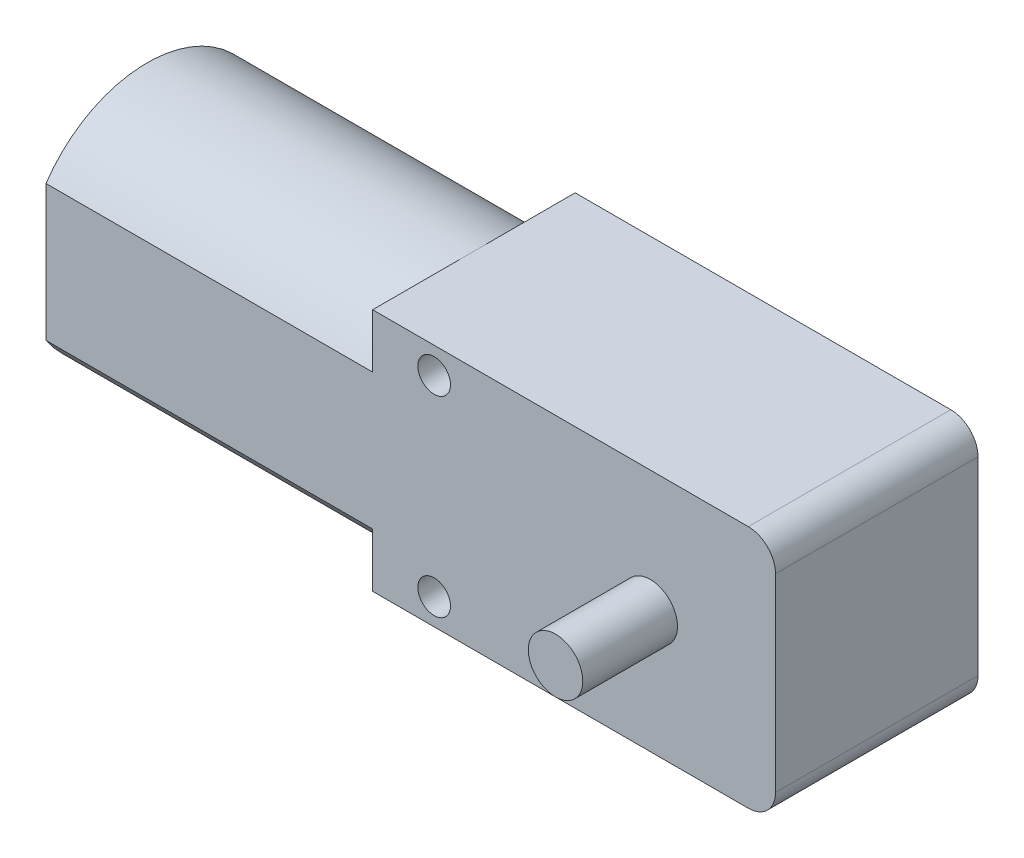
ISO-10303-21;
HEADER;
FILE_DESCRIPTION(('STEP AP214'),'2;1');
FILE_NAME('part.step','',(''),(''),'','','');
FILE_SCHEMA(('AUTOMOTIVE_DESIGN { 1 0 10303 214 1 1 1 1 }'));
ENDSEC;
DATA;
#1=APPLICATION_CONTEXT('core data for automotive mechanical design processes');
#2=APPLICATION_PROTOCOL_DEFINITION('international standard','automotive_design',2000,#1);
#3=PRODUCT_CONTEXT('',#1,'mechanical');
#4=PRODUCT('Part','Part','',(#3));
#5=PRODUCT_RELATED_PRODUCT_CATEGORY('part','',(#4));
#6=PRODUCT_DEFINITION_FORMATION('','',#4);
#7=PRODUCT_DEFINITION_CONTEXT('part definition',#1,'design');
#8=PRODUCT_DEFINITION('design','',#6,#7);
#9=PRODUCT_DEFINITION_SHAPE('','',#8);
#10=(LENGTH_UNIT() NAMED_UNIT(*) SI_UNIT(.MILLI.,.METRE.));
#11=(NAMED_UNIT(*) PLANE_ANGLE_UNIT() SI_UNIT($,.RADIAN.));
#12=(NAMED_UNIT(*) SI_UNIT($,.STERADIAN.) SOLID_ANGLE_UNIT());
#13=UNCERTAINTY_MEASURE_WITH_UNIT(LENGTH_MEASURE(1.E-05),#10,'distance_accuracy_value','');
#14=(GEOMETRIC_REPRESENTATION_CONTEXT(3) GLOBAL_UNCERTAINTY_ASSIGNED_CONTEXT((#13)) GLOBAL_UNIT_ASSIGNED_CONTEXT((#10,
#11,#12)) REPRESENTATION_CONTEXT('',''));
#15=CARTESIAN_POINT('',(0.,0.,0.));
#16=DIRECTION('',(0.,0.,1.));
#17=DIRECTION('',(1.,0.,0.));
#18=AXIS2_PLACEMENT_3D('',#15,#16,#17);
#19=CARTESIAN_POINT('',(0.,0.,18.6));
#20=DIRECTION('',(1.,0.,0.));
#21=DIRECTION('',(0.,1.,0.));
#22=AXIS2_PLACEMENT_3D('',#19,#20,#21);
#23=PLANE('',#22);
#24=CARTESIAN_POINT('',(0.,11.2,9.3));
#25=DIRECTION('',(-1.,0.,0.));
#26=DIRECTION('',(0.,-1.,0.));
#27=AXIS2_PLACEMENT_3D('',#24,#25,#26);
#28=CIRCLE('',#27,11.2);
#29=CARTESIAN_POINT('',(0.,4.95900648934803,0.));
#30=VERTEX_POINT('',#29);
#31=CARTESIAN_POINT('',(0.,0.,9.3));
#32=VERTEX_POINT('',#31);
#33=EDGE_CURVE('E241',#30,#32,#28,.T.);
#34=ORIENTED_EDGE('',*,*,#33,.F.);
#35=DIRECTION('',(0.,-1.,0.));
#36=VECTOR('',#35,1.);
#37=CARTESIAN_POINT('',(0.,0.,0.));
#38=LINE('',#37,#36);
#39=CARTESIAN_POINT('',(0.,0.,0.));
#40=VERTEX_POINT('',#39);
#41=EDGE_CURVE('E156',#30,#40,#38,.T.);
#42=ORIENTED_EDGE('',*,*,#41,.T.);
#43=DIRECTION('',(0.,0.,-1.));
#44=VECTOR('',#43,1.);
#45=CARTESIAN_POINT('',(0.,0.,18.6));
#46=LINE('',#45,#44);
#47=EDGE_CURVE('E196',#32,#40,#46,.T.);
#48=ORIENTED_EDGE('',*,*,#47,.F.);
#49=EDGE_LOOP('',(#34,#42,#48));
#50=FACE_BOUND('',#49,.T.);
#51=ADVANCED_FACE('F41',(#50),#23,.F.);
#52=CARTESIAN_POINT('',(0.,4.95900648934803,18.6));
#53=VERTEX_POINT('',#52);
#54=EDGE_CURVE('E154',#32,#53,#28,.T.);
#55=ORIENTED_EDGE('',*,*,#54,.F.);
#56=CARTESIAN_POINT('',(0.,0.,18.6));
#57=VERTEX_POINT('',#56);
#58=EDGE_CURVE('E197',#57,#32,#46,.T.);
#59=ORIENTED_EDGE('',*,*,#58,.F.);
#60=DIRECTION('',(0.,-1.,0.));
#61=VECTOR('',#60,1.);
#62=CARTESIAN_POINT('',(0.,0.,18.6));
#63=LINE('',#62,#61);
#64=EDGE_CURVE('E171',#53,#57,#63,.T.);
#65=ORIENTED_EDGE('',*,*,#64,.F.);
#66=EDGE_LOOP('',(#55,#59,#65));
#67=FACE_BOUND('',#66,.T.);
#68=ADVANCED_FACE('F315',(#67),#23,.F.);
#69=CARTESIAN_POINT('',(0.,11.2,9.3));
#70=DIRECTION('',(-1.,0.,0.));
#71=DIRECTION('',(0.,-1.,0.));
#72=AXIS2_PLACEMENT_3D('',#69,#70,#71);
#73=CIRCLE('',#72,11.2);
#74=CARTESIAN_POINT('',(0.,17.440993510652,18.6));
#75=VERTEX_POINT('',#74);
#76=CARTESIAN_POINT('',(0.,22.4,9.3));
#77=VERTEX_POINT('',#76);
#78=EDGE_CURVE('E149',#75,#77,#73,.T.);
#79=ORIENTED_EDGE('',*,*,#78,.F.);
#80=CARTESIAN_POINT('',(0.,22.4,18.6));
#81=VERTEX_POINT('',#80);
#82=EDGE_CURVE('E167',#81,#75,#63,.T.);
#83=ORIENTED_EDGE('',*,*,#82,.F.);
#84=DIRECTION('',(0.,0.,-1.));
#85=VECTOR('',#84,1.);
#86=CARTESIAN_POINT('',(0.,22.4,18.6));
#87=LINE('',#86,#85);
#88=EDGE_CURVE('E192',#81,#77,#87,.T.);
#89=ORIENTED_EDGE('',*,*,#88,.T.);
#90=EDGE_LOOP('',(#79,#83,#89));
#91=FACE_BOUND('',#90,.T.);
#92=ADVANCED_FACE('F321',(#91),#23,.F.);
#93=CARTESIAN_POINT('',(0.,17.440993510652,0.));
#94=VERTEX_POINT('',#93);
#95=EDGE_CURVE('E201',#77,#94,#73,.T.);
#96=ORIENTED_EDGE('',*,*,#95,.F.);
#97=CARTESIAN_POINT('',(0.,22.4,0.));
#98=VERTEX_POINT('',#97);
#99=EDGE_CURVE('E179',#77,#98,#87,.T.);
#100=ORIENTED_EDGE('',*,*,#99,.T.);
#101=EDGE_CURVE('E161',#98,#94,#38,.T.);
#102=ORIENTED_EDGE('',*,*,#101,.T.);
#103=EDGE_LOOP('',(#96,#100,#102));
#104=FACE_BOUND('',#103,.T.);
#105=ADVANCED_FACE('F317',(#104),#23,.F.);
#106=CARTESIAN_POINT('',(0.,0.,18.6));
#107=DIRECTION('',(0.,1.,0.));
#108=DIRECTION('',(0.,0.,1.));
#109=AXIS2_PLACEMENT_3D('',#106,#107,#108);
#110=PLANE('',#109);
#111=DIRECTION('',(1.,0.,0.));
#112=VECTOR('',#111,1.);
#113=CARTESIAN_POINT('',(0.,0.,0.));
#114=LINE('',#113,#112);
#115=CARTESIAN_POINT('',(34.5,0.,0.));
#116=VERTEX_POINT('',#115);
#117=EDGE_CURVE('E182',#40,#116,#114,.T.);
#118=ORIENTED_EDGE('',*,*,#117,.T.);
#119=DIRECTION('',(0.,0.,-1.));
#120=VECTOR('',#119,1.);
#121=CARTESIAN_POINT('',(34.5,0.,18.6));
#122=LINE('',#121,#120);
#123=CARTESIAN_POINT('',(34.5,0.,18.6));
#124=VERTEX_POINT('',#123);
#125=EDGE_CURVE('E65',#116,#124,#122,.F.);
#126=ORIENTED_EDGE('',*,*,#125,.T.);
#127=DIRECTION('',(1.,0.,0.));
#128=VECTOR('',#127,1.);
#129=CARTESIAN_POINT('',(0.,0.,18.6));
#130=LINE('',#129,#128);
#131=EDGE_CURVE('E170',#57,#124,#130,.T.);
#132=ORIENTED_EDGE('',*,*,#131,.F.);
#133=ORIENTED_EDGE('',*,*,#58,.T.);
#134=ORIENTED_EDGE('',*,*,#47,.T.);
#135=EDGE_LOOP('',(#118,#126,#132,#133,#134));
#136=FACE_BOUND('',#135,.T.);
#137=ADVANCED_FACE('F236',(#136),#110,.F.);
#138=CARTESIAN_POINT('',(37.,0.,18.6));
#139=DIRECTION('',(-1.,0.,0.));
#140=DIRECTION('',(0.,-1.,0.));
#141=AXIS2_PLACEMENT_3D('',#138,#139,#140);
#142=PLANE('',#141);
#143=DIRECTION('',(0.,1.,0.));
#144=VECTOR('',#143,1.);
#145=CARTESIAN_POINT('',(37.,0.,18.6));
#146=LINE('',#145,#144);
#147=CARTESIAN_POINT('',(37.,2.5,18.6));
#148=VERTEX_POINT('',#147);
#149=CARTESIAN_POINT('',(37.,19.9,18.6));
#150=VERTEX_POINT('',#149);
#151=EDGE_CURVE('E174',#148,#150,#146,.T.);
#152=ORIENTED_EDGE('',*,*,#151,.F.);
#153=DIRECTION('',(0.,0.,-1.));
#154=VECTOR('',#153,1.);
#155=CARTESIAN_POINT('',(37.,2.5,18.6));
#156=LINE('',#155,#154);
#157=CARTESIAN_POINT('',(37.,2.5,0.));
#158=VERTEX_POINT('',#157);
#159=EDGE_CURVE('E209',#148,#158,#156,.T.);
#160=ORIENTED_EDGE('',*,*,#159,.T.);
#161=DIRECTION('',(0.,1.,0.));
#162=VECTOR('',#161,1.);
#163=CARTESIAN_POINT('',(37.,0.,0.));
#164=LINE('',#163,#162);
#165=CARTESIAN_POINT('',(37.,19.9,0.));
#166=VERTEX_POINT('',#165);
#167=EDGE_CURVE('E185',#158,#166,#164,.T.);
#168=ORIENTED_EDGE('',*,*,#167,.T.);
#169=DIRECTION('',(0.,0.,-1.));
#170=VECTOR('',#169,1.);
#171=CARTESIAN_POINT('',(37.,19.9,18.6));
#172=LINE('',#171,#170);
#173=EDGE_CURVE('E206',#166,#150,#172,.F.);
#174=ORIENTED_EDGE('',*,*,#173,.T.);
#175=EDGE_LOOP('',(#152,#160,#168,#174));
#176=FACE_BOUND('',#175,.T.);
#177=ADVANCED_FACE('F228',(#176),#142,.F.);
#178=CARTESIAN_POINT('',(0.,22.4,18.6));
#179=DIRECTION('',(0.,-1.,0.));
#180=DIRECTION('',(0.,0.,-1.));
#181=AXIS2_PLACEMENT_3D('',#178,#179,#180);
#182=PLANE('',#181);
#183=DIRECTION('',(-1.,0.,0.));
#184=VECTOR('',#183,1.);
#185=CARTESIAN_POINT('',(0.,22.4,18.6));
#186=LINE('',#185,#184);
#187=CARTESIAN_POINT('',(34.5,22.4,18.6));
#188=VERTEX_POINT('',#187);
#189=EDGE_CURVE('E177',#188,#81,#186,.T.);
#190=ORIENTED_EDGE('',*,*,#189,.F.);
#191=DIRECTION('',(0.,0.,-1.));
#192=VECTOR('',#191,1.);
#193=CARTESIAN_POINT('',(34.5,22.4,18.6));
#194=LINE('',#193,#192);
#195=CARTESIAN_POINT('',(34.5,22.4,0.));
#196=VERTEX_POINT('',#195);
#197=EDGE_CURVE('E12',#188,#196,#194,.T.);
#198=ORIENTED_EDGE('',*,*,#197,.T.);
#199=DIRECTION('',(-1.,0.,0.));
#200=VECTOR('',#199,1.);
#201=CARTESIAN_POINT('',(0.,22.4,0.));
#202=LINE('',#201,#200);
#203=EDGE_CURVE('E189',#196,#98,#202,.T.);
#204=ORIENTED_EDGE('',*,*,#203,.T.);
#205=ORIENTED_EDGE('',*,*,#99,.F.);
#206=ORIENTED_EDGE('',*,*,#88,.F.);
#207=EDGE_LOOP('',(#190,#198,#204,#205,#206));
#208=FACE_BOUND('',#207,.T.);
#209=ADVANCED_FACE('F291',(#208),#182,.F.);
#210=CARTESIAN_POINT('',(0.,0.,18.6));
#211=DIRECTION('',(0.,0.,-1.));
#212=DIRECTION('',(-1.,0.,0.));
#213=AXIS2_PLACEMENT_3D('',#210,#211,#212);
#214=PLANE('',#213);
#215=CARTESIAN_POINT('',(5.65000000000001,20.,18.6));
#216=DIRECTION('',(0.,0.,1.));
#217=DIRECTION('',(1.,0.,0.));
#218=AXIS2_PLACEMENT_3D('',#215,#216,#217);
#219=CIRCLE('',#218,1.5);
#220=CARTESIAN_POINT('',(7.15000000000001,20.,18.6));
#221=VERTEX_POINT('',#220);
#222=EDGE_CURVE('E274',#221,#221,#219,.T.);
#223=ORIENTED_EDGE('',*,*,#222,.F.);
#224=EDGE_LOOP('',(#223));
#225=FACE_BOUND('',#224,.T.);
#226=CARTESIAN_POINT('',(5.65000000000001,2.4,18.6));
#227=DIRECTION('',(0.,0.,1.));
#228=DIRECTION('',(1.,0.,0.));
#229=AXIS2_PLACEMENT_3D('',#226,#227,#228);
#230=CIRCLE('',#229,1.5);
#231=CARTESIAN_POINT('',(7.15000000000001,2.4,18.6));
#232=VERTEX_POINT('',#231);
#233=EDGE_CURVE('E275',#232,#232,#230,.T.);
#234=ORIENTED_EDGE('',*,*,#233,.F.);
#235=EDGE_LOOP('',(#234));
#236=FACE_BOUND('',#235,.T.);
#237=CARTESIAN_POINT('',(25.5,11.2,18.6));
#238=DIRECTION('',(0.,0.,-1.));
#239=DIRECTION('',(-1.,0.,0.));
#240=AXIS2_PLACEMENT_3D('',#237,#238,#239);
#241=CIRCLE('',#240,2.5);
#242=CARTESIAN_POINT('',(28.,11.2,18.6));
#243=VERTEX_POINT('',#242);
#244=EDGE_CURVE('E254',#243,#243,#241,.T.);
#245=ORIENTED_EDGE('',*,*,#244,.T.);
#246=EDGE_LOOP('',(#245));
#247=FACE_BOUND('',#246,.T.);
#248=ORIENTED_EDGE('',*,*,#131,.T.);
#249=CARTESIAN_POINT('',(34.5,2.5,18.6));
#250=DIRECTION('',(0.,0.,-1.));
#251=DIRECTION('',(-1.,0.,0.));
#252=AXIS2_PLACEMENT_3D('',#249,#250,#251);
#253=CIRCLE('',#252,2.5);
#254=EDGE_CURVE('E50',#124,#148,#253,.F.);
#255=ORIENTED_EDGE('',*,*,#254,.T.);
#256=ORIENTED_EDGE('',*,*,#151,.T.);
#257=CARTESIAN_POINT('',(34.5,19.9,18.6));
#258=DIRECTION('',(0.,0.,-1.));
#259=DIRECTION('',(-1.,0.,0.));
#260=AXIS2_PLACEMENT_3D('',#257,#258,#259);
#261=CIRCLE('',#260,2.5);
#262=EDGE_CURVE('E57',#150,#188,#261,.F.);
#263=ORIENTED_EDGE('',*,*,#262,.T.);
#264=ORIENTED_EDGE('',*,*,#189,.T.);
#265=ORIENTED_EDGE('',*,*,#82,.T.);
#266=DIRECTION('',(1.,0.,0.));
#267=VECTOR('',#266,1.);
#268=CARTESIAN_POINT('',(-30.,17.440993510652,18.6));
#269=LINE('',#268,#267);
#270=CARTESIAN_POINT('',(-30.,17.440993510652,18.6));
#271=VERTEX_POINT('',#270);
#272=EDGE_CURVE('E134',#271,#75,#269,.T.);
#273=ORIENTED_EDGE('',*,*,#272,.F.);
#274=DIRECTION('',(0.,1.,0.));
#275=VECTOR('',#274,1.);
#276=CARTESIAN_POINT('',(-30.,17.440993510652,18.6));
#277=LINE('',#276,#275);
#278=CARTESIAN_POINT('',(-30.,4.95900648934801,18.6));
#279=VERTEX_POINT('',#278);
#280=EDGE_CURVE('E127',#279,#271,#277,.T.);
#281=ORIENTED_EDGE('',*,*,#280,.F.);
#282=DIRECTION('',(1.,0.,0.));
#283=VECTOR('',#282,1.);
#284=CARTESIAN_POINT('',(-30.,4.95900648934801,18.6));
#285=LINE('',#284,#283);
#286=EDGE_CURVE('E131',#279,#53,#285,.T.);
#287=ORIENTED_EDGE('',*,*,#286,.T.);
#288=ORIENTED_EDGE('',*,*,#64,.T.);
#289=EDGE_LOOP('',(#248,#255,#256,#263,#264,#265,#273,#281,#287,#288));
#290=FACE_BOUND('',#289,.T.);
#291=ADVANCED_FACE('F129',(#225,#236,#247,#290),#214,.F.);
#292=CARTESIAN_POINT('',(0.,0.,0.));
#293=DIRECTION('',(0.,0.,-1.));
#294=DIRECTION('',(-1.,0.,0.));
#295=AXIS2_PLACEMENT_3D('',#292,#293,#294);
#296=PLANE('',#295);
#297=CARTESIAN_POINT('',(5.65000000000001,20.,0.));
#298=DIRECTION('',(0.,0.,-1.));
#299=DIRECTION('',(-1.,0.,0.));
#300=AXIS2_PLACEMENT_3D('',#297,#298,#299);
#301=CIRCLE('',#300,1.5);
#302=CARTESIAN_POINT('',(7.15000000000001,20.,0.));
#303=VERTEX_POINT('',#302);
#304=EDGE_CURVE('E269',#303,#303,#301,.F.);
#305=ORIENTED_EDGE('',*,*,#304,.T.);
#306=EDGE_LOOP('',(#305));
#307=FACE_BOUND('',#306,.T.);
#308=CARTESIAN_POINT('',(5.65000000000001,2.4,0.));
#309=DIRECTION('',(0.,0.,-1.));
#310=DIRECTION('',(-1.,0.,0.));
#311=AXIS2_PLACEMENT_3D('',#308,#309,#310);
#312=CIRCLE('',#311,1.5);
#313=CARTESIAN_POINT('',(7.15000000000001,2.4,0.));
#314=VERTEX_POINT('',#313);
#315=EDGE_CURVE('E270',#314,#314,#312,.F.);
#316=ORIENTED_EDGE('',*,*,#315,.T.);
#317=EDGE_LOOP('',(#316));
#318=FACE_BOUND('',#317,.T.);
#319=CARTESIAN_POINT('',(25.5,11.2,0.));
#320=DIRECTION('',(0.,0.,-1.));
#321=DIRECTION('',(-1.,0.,0.));
#322=AXIS2_PLACEMENT_3D('',#319,#320,#321);
#323=CIRCLE('',#322,2.5);
#324=CARTESIAN_POINT('',(28.,11.2,0.));
#325=VERTEX_POINT('',#324);
#326=EDGE_CURVE('E202',#325,#325,#323,.T.);
#327=ORIENTED_EDGE('',*,*,#326,.F.);
#328=EDGE_LOOP('',(#327));
#329=FACE_BOUND('',#328,.T.);
#330=ORIENTED_EDGE('',*,*,#167,.F.);
#331=CARTESIAN_POINT('',(34.5,2.5,0.));
#332=DIRECTION('',(0.,0.,-1.));
#333=DIRECTION('',(-1.,0.,0.));
#334=AXIS2_PLACEMENT_3D('',#331,#332,#333);
#335=CIRCLE('',#334,2.5);
#336=EDGE_CURVE('E216',#158,#116,#335,.T.);
#337=ORIENTED_EDGE('',*,*,#336,.T.);
#338=ORIENTED_EDGE('',*,*,#117,.F.);
#339=ORIENTED_EDGE('',*,*,#41,.F.);
#340=DIRECTION('',(1.,0.,0.));
#341=VECTOR('',#340,1.);
#342=CARTESIAN_POINT('',(-30.,4.95900648934801,0.));
#343=LINE('',#342,#341);
#344=CARTESIAN_POINT('',(-30.,4.95900648934801,0.));
#345=VERTEX_POINT('',#344);
#346=EDGE_CURVE('E242',#345,#30,#343,.T.);
#347=ORIENTED_EDGE('',*,*,#346,.F.);
#348=DIRECTION('',(0.,-1.,0.));
#349=VECTOR('',#348,1.);
#350=CARTESIAN_POINT('',(-30.,17.440993510652,0.));
#351=LINE('',#350,#349);
#352=CARTESIAN_POINT('',(-30.,17.440993510652,0.));
#353=VERTEX_POINT('',#352);
#354=EDGE_CURVE('E144',#353,#345,#351,.T.);
#355=ORIENTED_EDGE('',*,*,#354,.F.);
#356=DIRECTION('',(1.,0.,0.));
#357=VECTOR('',#356,1.);
#358=CARTESIAN_POINT('',(-30.,17.440993510652,0.));
#359=LINE('',#358,#357);
#360=EDGE_CURVE('E163',#353,#94,#359,.T.);
#361=ORIENTED_EDGE('',*,*,#360,.T.);
#362=ORIENTED_EDGE('',*,*,#101,.F.);
#363=ORIENTED_EDGE('',*,*,#203,.F.);
#364=CARTESIAN_POINT('',(34.5,19.9,0.));
#365=DIRECTION('',(0.,0.,-1.));
#366=DIRECTION('',(-1.,0.,0.));
#367=AXIS2_PLACEMENT_3D('',#364,#365,#366);
#368=CIRCLE('',#367,2.5);
#369=EDGE_CURVE('E213',#196,#166,#368,.T.);
#370=ORIENTED_EDGE('',*,*,#369,.T.);
#371=EDGE_LOOP('',(#330,#337,#338,#339,#347,#355,#361,#362,#363,#370));
#372=FACE_BOUND('',#371,.T.);
#373=ADVANCED_FACE('F234',(#307,#318,#329,#372),#296,.T.);
#374=CARTESIAN_POINT('',(-30.,11.2,9.3));
#375=DIRECTION('',(1.,0.,0.));
#376=DIRECTION('',(0.,1.,0.));
#377=AXIS2_PLACEMENT_3D('',#374,#375,#376);
#378=CYLINDRICAL_SURFACE('',#377,11.2);
#379=ORIENTED_EDGE('',*,*,#33,.T.);
#380=ORIENTED_EDGE('',*,*,#54,.T.);
#381=ORIENTED_EDGE('',*,*,#286,.F.);
#382=CARTESIAN_POINT('',(-30.,11.2,9.3));
#383=DIRECTION('',(-1.,0.,0.));
#384=DIRECTION('',(0.,-1.,0.));
#385=AXIS2_PLACEMENT_3D('',#382,#383,#384);
#386=CIRCLE('',#385,11.2);
#387=EDGE_CURVE('E139',#345,#279,#386,.T.);
#388=ORIENTED_EDGE('',*,*,#387,.F.);
#389=ORIENTED_EDGE('',*,*,#346,.T.);
#390=EDGE_LOOP('',(#379,#380,#381,#388,#389));
#391=FACE_BOUND('',#390,.T.);
#392=ADVANCED_FACE('F153',(#391),#378,.T.);
#393=CARTESIAN_POINT('',(-30.,11.2,9.3));
#394=DIRECTION('',(1.,0.,0.));
#395=DIRECTION('',(0.,1.,0.));
#396=AXIS2_PLACEMENT_3D('',#393,#394,#395);
#397=CYLINDRICAL_SURFACE('',#396,11.2);
#398=ORIENTED_EDGE('',*,*,#78,.T.);
#399=ORIENTED_EDGE('',*,*,#95,.T.);
#400=ORIENTED_EDGE('',*,*,#360,.F.);
#401=CARTESIAN_POINT('',(-30.,11.2,9.3));
#402=DIRECTION('',(-1.,0.,0.));
#403=DIRECTION('',(0.,-1.,0.));
#404=AXIS2_PLACEMENT_3D('',#401,#402,#403);
#405=CIRCLE('',#404,11.2);
#406=EDGE_CURVE('E138',#271,#353,#405,.T.);
#407=ORIENTED_EDGE('',*,*,#406,.F.);
#408=ORIENTED_EDGE('',*,*,#272,.T.);
#409=EDGE_LOOP('',(#398,#399,#400,#407,#408));
#410=FACE_BOUND('',#409,.T.);
#411=ADVANCED_FACE('F343',(#410),#397,.T.);
#412=CARTESIAN_POINT('',(-30.,11.2,9.3));
#413=DIRECTION('',(-1.,0.,0.));
#414=DIRECTION('',(0.,-1.,0.));
#415=AXIS2_PLACEMENT_3D('',#412,#413,#414);
#416=PLANE('',#415);
#417=ORIENTED_EDGE('',*,*,#387,.T.);
#418=ORIENTED_EDGE('',*,*,#280,.T.);
#419=ORIENTED_EDGE('',*,*,#406,.T.);
#420=ORIENTED_EDGE('',*,*,#354,.T.);
#421=EDGE_LOOP('',(#417,#418,#419,#420));
#422=FACE_BOUND('',#421,.T.);
#423=ADVANCED_FACE('F142',(#422),#416,.T.);
#424=CARTESIAN_POINT('',(0.,0.,-8.7));
#425=DIRECTION('',(0.,0.,-1.));
#426=DIRECTION('',(-1.,0.,0.));
#427=AXIS2_PLACEMENT_3D('',#424,#425,#426);
#428=PLANE('',#427);
#429=CARTESIAN_POINT('',(25.5,11.2,-8.7));
#430=DIRECTION('',(0.,0.,-1.));
#431=DIRECTION('',(-1.,0.,0.));
#432=AXIS2_PLACEMENT_3D('',#429,#430,#431);
#433=CIRCLE('',#432,2.5);
#434=CARTESIAN_POINT('',(28.,11.2,-8.7));
#435=VERTEX_POINT('',#434);
#436=EDGE_CURVE('E261',#435,#435,#433,.F.);
#437=ORIENTED_EDGE('',*,*,#436,.F.);
#438=EDGE_LOOP('',(#437));
#439=FACE_BOUND('',#438,.T.);
#440=ADVANCED_FACE('F310',(#439),#428,.T.);
#441=CARTESIAN_POINT('',(25.5,11.2,-24.4710678118655));
#442=DIRECTION('',(0.,0.,1.));
#443=DIRECTION('',(1.,0.,0.));
#444=AXIS2_PLACEMENT_3D('',#441,#442,#443);
#445=CYLINDRICAL_SURFACE('',#444,2.5);
#446=CARTESIAN_POINT('',(28.,11.2,0.));
#447=CARTESIAN_POINT('',(28.,11.2,-0.0906250000000003));
#448=CARTESIAN_POINT('',(28.,11.2,-0.181250000000001));
#449=CARTESIAN_POINT('',(28.,11.2,-0.362500000000001));
#450=CARTESIAN_POINT('',(28.,11.2,-0.453125));
#451=CARTESIAN_POINT('',(28.,11.2,-0.634374999999999));
#452=CARTESIAN_POINT('',(28.,11.2,-0.725));
#453=CARTESIAN_POINT('',(28.,11.2,-0.90625));
#454=CARTESIAN_POINT('',(28.,11.2,-0.996874999999999));
#455=CARTESIAN_POINT('',(28.,11.2,-1.178125));
#456=CARTESIAN_POINT('',(28.,11.2,-1.26875));
#457=CARTESIAN_POINT('',(28.,11.2,-1.45));
#458=CARTESIAN_POINT('',(28.,11.2,-1.540625));
#459=CARTESIAN_POINT('',(28.,11.2,-1.721875));
#460=CARTESIAN_POINT('',(28.,11.2,-1.8125));
#461=CARTESIAN_POINT('',(28.,11.2,-1.99375));
#462=CARTESIAN_POINT('',(28.,11.2,-2.084375));
#463=CARTESIAN_POINT('',(28.,11.2,-2.265625));
#464=CARTESIAN_POINT('',(28.,11.2,-2.35625));
#465=CARTESIAN_POINT('',(28.,11.2,-2.5375));
#466=CARTESIAN_POINT('',(28.,11.2,-2.628125));
#467=CARTESIAN_POINT('',(28.,11.2,-2.809375));
#468=CARTESIAN_POINT('',(28.,11.2,-2.9));
#469=CARTESIAN_POINT('',(28.,11.2,-3.08125));
#470=CARTESIAN_POINT('',(28.,11.2,-3.171875));
#471=CARTESIAN_POINT('',(28.,11.2,-3.353125));
#472=CARTESIAN_POINT('',(28.,11.2,-3.44375));
#473=CARTESIAN_POINT('',(28.,11.2,-3.625));
#474=CARTESIAN_POINT('',(28.,11.2,-3.715625));
#475=CARTESIAN_POINT('',(28.,11.2,-3.896875));
#476=CARTESIAN_POINT('',(28.,11.2,-3.9875));
#477=CARTESIAN_POINT('',(28.,11.2,-4.16875));
#478=CARTESIAN_POINT('',(28.,11.2,-4.259375));
#479=CARTESIAN_POINT('',(28.,11.2,-4.440625));
#480=CARTESIAN_POINT('',(28.,11.2,-4.53125));
#481=CARTESIAN_POINT('',(28.,11.2,-4.7125));
#482=CARTESIAN_POINT('',(28.,11.2,-4.803125));
#483=CARTESIAN_POINT('',(28.,11.2,-4.984375));
#484=CARTESIAN_POINT('',(28.,11.2,-5.075));
#485=CARTESIAN_POINT('',(28.,11.2,-5.25625));
#486=CARTESIAN_POINT('',(28.,11.2,-5.346875));
#487=CARTESIAN_POINT('',(28.,11.2,-5.528125));
#488=CARTESIAN_POINT('',(28.,11.2,-5.61875));
#489=CARTESIAN_POINT('',(28.,11.2,-5.8));
#490=CARTESIAN_POINT('',(28.,11.2,-5.890625));
#491=CARTESIAN_POINT('',(28.,11.2,-6.071875));
#492=CARTESIAN_POINT('',(28.,11.2,-6.1625));
#493=CARTESIAN_POINT('',(28.,11.2,-6.34375));
#494=CARTESIAN_POINT('',(28.,11.2,-6.434375));
#495=CARTESIAN_POINT('',(28.,11.2,-6.615625));
#496=CARTESIAN_POINT('',(28.,11.2,-6.70625));
#497=CARTESIAN_POINT('',(28.,11.2,-6.8875));
#498=CARTESIAN_POINT('',(28.,11.2,-6.978125));
#499=CARTESIAN_POINT('',(28.,11.2,-7.159375));
#500=CARTESIAN_POINT('',(28.,11.2,-7.25));
#501=CARTESIAN_POINT('',(28.,11.2,-7.43125));
#502=CARTESIAN_POINT('',(28.,11.2,-7.521875));
#503=CARTESIAN_POINT('',(28.,11.2,-7.703125));
#504=CARTESIAN_POINT('',(28.,11.2,-7.79375));
#505=CARTESIAN_POINT('',(28.,11.2,-7.975));
#506=CARTESIAN_POINT('',(28.,11.2,-8.065625));
#507=CARTESIAN_POINT('',(28.,11.2,-8.246875));
#508=CARTESIAN_POINT('',(28.,11.2,-8.3375));
#509=CARTESIAN_POINT('',(28.,11.2,-8.51875));
#510=CARTESIAN_POINT('',(28.,11.2,-8.609375));
#511=CARTESIAN_POINT('',(28.,11.2,-8.7));
#512=B_SPLINE_CURVE_WITH_KNOTS('',3,(#446,#447,#448,#449,#450,#451,#452,#453,#454,#455,#456,
#457,#458,#459,#460,#461,#462,#463,#464,#465,#466,#467,#468,#469,#470,#471,#472,#473,#474,#475,
#476,#477,#478,#479,#480,#481,#482,#483,#484,#485,#486,#487,#488,#489,#490,#491,#492,#493,#494,
#495,#496,#497,#498,#499,#500,#501,#502,#503,#504,#505,#506,#507,#508,#509,#510,#511),
.UNSPECIFIED.,.F.,.F.,(4,2,2,2,2,2,2,2,2,2,2,2,2,2,2,2,2,2,2,2,2,2,2,2,2,2,2,2,2,2,2,2,4),(0.,
0.271875000000001,0.543749999999999,0.815625,1.0875,1.359375,1.63125,1.903125,2.175,2.446875,
2.71875,2.990625,3.2625,3.534375,3.80625,4.078125,4.35,4.621875,4.89375,5.165625,5.4375,
5.709375,5.98125,6.253125,6.525,6.796875,7.06875,7.340625,7.6125,7.884375,8.15625,8.428125,8.7),.UNSPECIFIED.);
#513=EDGE_CURVE('BSEAM300',#325,#435,#512,.T.);
#514=ORIENTED_EDGE('',*,*,#326,.T.);
#515=ORIENTED_EDGE('',*,*,#436,.T.);
#516=ORIENTED_EDGE('',*,*,#513,.T.);
#517=ORIENTED_EDGE('',*,*,#513,.F.);
#518=EDGE_LOOP('',(#514,#516,#515,#517));
#519=FACE_BOUND('',#518,.T.);
#520=ADVANCED_FACE('F300',(#519),#445,.T.);
#521=CARTESIAN_POINT('',(25.5,11.2,27.3));
#522=DIRECTION('',(0.,0.,1.));
#523=DIRECTION('',(1.,0.,0.));
#524=AXIS2_PLACEMENT_3D('',#521,#522,#523);
#525=CIRCLE('',#524,2.5);
#526=CARTESIAN_POINT('',(28.,11.2,27.3));
#527=VERTEX_POINT('',#526);
#528=EDGE_CURVE('E265',#527,#527,#525,.T.);
#529=CARTESIAN_POINT('',(28.,11.2,27.3));
#530=CARTESIAN_POINT('',(28.,11.2,27.209375));
#531=CARTESIAN_POINT('',(28.,11.2,27.11875));
#532=CARTESIAN_POINT('',(28.,11.2,26.9375));
#533=CARTESIAN_POINT('',(28.,11.2,26.846875));
#534=CARTESIAN_POINT('',(28.,11.2,26.665625));
#535=CARTESIAN_POINT('',(28.,11.2,26.575));
#536=CARTESIAN_POINT('',(28.,11.2,26.39375));
#537=CARTESIAN_POINT('',(28.,11.2,26.303125));
#538=CARTESIAN_POINT('',(28.,11.2,26.121875));
#539=CARTESIAN_POINT('',(28.,11.2,26.03125));
#540=CARTESIAN_POINT('',(28.,11.2,25.85));
#541=CARTESIAN_POINT('',(28.,11.2,25.759375));
#542=CARTESIAN_POINT('',(28.,11.2,25.578125));
#543=CARTESIAN_POINT('',(28.,11.2,25.4875));
#544=CARTESIAN_POINT('',(28.,11.2,25.30625));
#545=CARTESIAN_POINT('',(28.,11.2,25.215625));
#546=CARTESIAN_POINT('',(28.,11.2,25.034375));
#547=CARTESIAN_POINT('',(28.,11.2,24.94375));
#548=CARTESIAN_POINT('',(28.,11.2,24.7625));
#549=CARTESIAN_POINT('',(28.,11.2,24.671875));
#550=CARTESIAN_POINT('',(28.,11.2,24.490625));
#551=CARTESIAN_POINT('',(28.,11.2,24.4));
#552=CARTESIAN_POINT('',(28.,11.2,24.21875));
#553=CARTESIAN_POINT('',(28.,11.2,24.128125));
#554=CARTESIAN_POINT('',(28.,11.2,23.946875));
#555=CARTESIAN_POINT('',(28.,11.2,23.85625));
#556=CARTESIAN_POINT('',(28.,11.2,23.675));
#557=CARTESIAN_POINT('',(28.,11.2,23.584375));
#558=CARTESIAN_POINT('',(28.,11.2,23.403125));
#559=CARTESIAN_POINT('',(28.,11.2,23.3125));
#560=CARTESIAN_POINT('',(28.,11.2,23.13125));
#561=CARTESIAN_POINT('',(28.,11.2,23.040625));
#562=CARTESIAN_POINT('',(28.,11.2,22.859375));
#563=CARTESIAN_POINT('',(28.,11.2,22.76875));
#564=CARTESIAN_POINT('',(28.,11.2,22.5875));
#565=CARTESIAN_POINT('',(28.,11.2,22.496875));
#566=CARTESIAN_POINT('',(28.,11.2,22.315625));
#567=CARTESIAN_POINT('',(28.,11.2,22.225));
#568=CARTESIAN_POINT('',(28.,11.2,22.04375));
#569=CARTESIAN_POINT('',(28.,11.2,21.953125));
#570=CARTESIAN_POINT('',(28.,11.2,21.771875));
#571=CARTESIAN_POINT('',(28.,11.2,21.68125));
#572=CARTESIAN_POINT('',(28.,11.2,21.5));
#573=CARTESIAN_POINT('',(28.,11.2,21.409375));
#574=CARTESIAN_POINT('',(28.,11.2,21.228125));
#575=CARTESIAN_POINT('',(28.,11.2,21.1375));
#576=CARTESIAN_POINT('',(28.,11.2,20.95625));
#577=CARTESIAN_POINT('',(28.,11.2,20.865625));
#578=CARTESIAN_POINT('',(28.,11.2,20.684375));
#579=CARTESIAN_POINT('',(28.,11.2,20.59375));
#580=CARTESIAN_POINT('',(28.,11.2,20.4125));
#581=CARTESIAN_POINT('',(28.,11.2,20.321875));
#582=CARTESIAN_POINT('',(28.,11.2,20.140625));
#583=CARTESIAN_POINT('',(28.,11.2,20.05));
#584=CARTESIAN_POINT('',(28.,11.2,19.86875));
#585=CARTESIAN_POINT('',(28.,11.2,19.778125));
#586=CARTESIAN_POINT('',(28.,11.2,19.596875));
#587=CARTESIAN_POINT('',(28.,11.2,19.50625));
#588=CARTESIAN_POINT('',(28.,11.2,19.325));
#589=CARTESIAN_POINT('',(28.,11.2,19.234375));
#590=CARTESIAN_POINT('',(28.,11.2,19.053125));
#591=CARTESIAN_POINT('',(28.,11.2,18.9625));
#592=CARTESIAN_POINT('',(28.,11.2,18.78125));
#593=CARTESIAN_POINT('',(28.,11.2,18.690625));
#594=CARTESIAN_POINT('',(28.,11.2,18.6));
#595=B_SPLINE_CURVE_WITH_KNOTS('',3,(#529,#530,#531,#532,#533,#534,#535,#536,#537,#538,#539,
#540,#541,#542,#543,#544,#545,#546,#547,#548,#549,#550,#551,#552,#553,#554,#555,#556,#557,#558,
#559,#560,#561,#562,#563,#564,#565,#566,#567,#568,#569,#570,#571,#572,#573,#574,#575,#576,#577,
#578,#579,#580,#581,#582,#583,#584,#585,#586,#587,#588,#589,#590,#591,#592,#593,#594),
.UNSPECIFIED.,.F.,.F.,(4,2,2,2,2,2,2,2,2,2,2,2,2,2,2,2,2,2,2,2,2,2,2,2,2,2,2,2,2,2,2,2,4),(0.,
0.271874999999998,0.543750000000003,0.815625,1.0875,1.359375,1.63125,1.903125,2.175,2.446875,
2.71875,2.990625,3.2625,3.534375,3.80625,4.078125,4.35,4.621875,4.89375,5.165625,5.4375,
5.709375,5.98125,6.253125,6.525,6.796875,7.06875,7.340625,7.6125,7.884375,8.15625,8.428125,8.7),.UNSPECIFIED.);
#596=EDGE_CURVE('BSEAM297',#527,#243,#595,.T.);
#597=ORIENTED_EDGE('',*,*,#528,.F.);
#598=ORIENTED_EDGE('',*,*,#244,.F.);
#599=ORIENTED_EDGE('',*,*,#596,.T.);
#600=ORIENTED_EDGE('',*,*,#596,.F.);
#601=EDGE_LOOP('',(#597,#599,#598,#600));
#602=FACE_BOUND('',#601,.T.);
#603=ADVANCED_FACE('F297',(#602),#445,.T.);
#604=CARTESIAN_POINT('',(25.5,11.2,27.3));
#605=DIRECTION('',(0.,0.,1.));
#606=DIRECTION('',(1.,0.,0.));
#607=AXIS2_PLACEMENT_3D('',#604,#605,#606);
#608=PLANE('',#607);
#609=ORIENTED_EDGE('',*,*,#528,.T.);
#610=EDGE_LOOP('',(#609));
#611=FACE_BOUND('',#610,.T.);
#612=ADVANCED_FACE('F299',(#611),#608,.T.);
#613=CARTESIAN_POINT('',(5.65000000000001,2.4,-4.24264068711928));
#614=DIRECTION('',(0.,0.,1.));
#615=DIRECTION('',(1.,0.,0.));
#616=AXIS2_PLACEMENT_3D('',#613,#614,#615);
#617=CYLINDRICAL_SURFACE('',#616,1.5);
#618=CARTESIAN_POINT('',(7.15000000000001,2.4,18.6));
#619=CARTESIAN_POINT('',(7.15000000000001,2.4,18.40625));
#620=CARTESIAN_POINT('',(7.15000000000001,2.4,18.2125));
#621=CARTESIAN_POINT('',(7.15000000000001,2.4,17.825));
#622=CARTESIAN_POINT('',(7.15000000000001,2.4,17.63125));
#623=CARTESIAN_POINT('',(7.15000000000001,2.4,17.24375));
#624=CARTESIAN_POINT('',(7.15000000000001,2.4,17.05));
#625=CARTESIAN_POINT('',(7.15000000000001,2.4,16.6625));
#626=CARTESIAN_POINT('',(7.15000000000001,2.4,16.46875));
#627=CARTESIAN_POINT('',(7.15000000000001,2.4,16.08125));
#628=CARTESIAN_POINT('',(7.15000000000001,2.4,15.8875));
#629=CARTESIAN_POINT('',(7.15000000000001,2.4,15.5));
#630=CARTESIAN_POINT('',(7.15000000000001,2.4,15.30625));
#631=CARTESIAN_POINT('',(7.15000000000001,2.4,14.91875));
#632=CARTESIAN_POINT('',(7.15000000000001,2.4,14.725));
#633=CARTESIAN_POINT('',(7.15000000000001,2.4,14.3375));
#634=CARTESIAN_POINT('',(7.15000000000001,2.4,14.14375));
#635=CARTESIAN_POINT('',(7.15000000000001,2.4,13.75625));
#636=CARTESIAN_POINT('',(7.15000000000001,2.4,13.5625));
#637=CARTESIAN_POINT('',(7.15000000000001,2.4,13.175));
#638=CARTESIAN_POINT('',(7.15000000000001,2.4,12.98125));
#639=CARTESIAN_POINT('',(7.15000000000001,2.4,12.59375));
#640=CARTESIAN_POINT('',(7.15000000000001,2.4,12.4));
#641=CARTESIAN_POINT('',(7.15000000000001,2.4,12.0125));
#642=CARTESIAN_POINT('',(7.15000000000001,2.4,11.81875));
#643=CARTESIAN_POINT('',(7.15000000000001,2.4,11.43125));
#644=CARTESIAN_POINT('',(7.15000000000001,2.4,11.2375));
#645=CARTESIAN_POINT('',(7.15000000000001,2.4,10.85));
#646=CARTESIAN_POINT('',(7.15000000000001,2.4,10.65625));
#647=CARTESIAN_POINT('',(7.15000000000001,2.4,10.26875));
#648=CARTESIAN_POINT('',(7.15000000000001,2.4,10.075));
#649=CARTESIAN_POINT('',(7.15000000000001,2.4,9.6875));
#650=CARTESIAN_POINT('',(7.15000000000001,2.4,9.49375));
#651=CARTESIAN_POINT('',(7.15000000000001,2.4,9.10625));
#652=CARTESIAN_POINT('',(7.15000000000001,2.4,8.9125));
#653=CARTESIAN_POINT('',(7.15000000000001,2.4,8.525));
#654=CARTESIAN_POINT('',(7.15000000000001,2.4,8.33125));
#655=CARTESIAN_POINT('',(7.15000000000001,2.4,7.94375));
#656=CARTESIAN_POINT('',(7.15000000000001,2.4,7.75));
#657=CARTESIAN_POINT('',(7.15000000000001,2.4,7.3625));
#658=CARTESIAN_POINT('',(7.15000000000001,2.4,7.16875));
#659=CARTESIAN_POINT('',(7.15000000000001,2.4,6.78125));
#660=CARTESIAN_POINT('',(7.15000000000001,2.4,6.5875));
#661=CARTESIAN_POINT('',(7.15000000000001,2.4,6.2));
#662=CARTESIAN_POINT('',(7.15000000000001,2.4,6.00625));
#663=CARTESIAN_POINT('',(7.15000000000001,2.4,5.61875));
#664=CARTESIAN_POINT('',(7.15000000000001,2.4,5.425));
#665=CARTESIAN_POINT('',(7.15000000000001,2.4,5.0375));
#666=CARTESIAN_POINT('',(7.15000000000001,2.4,4.84375));
#667=CARTESIAN_POINT('',(7.15000000000001,2.4,4.45625));
#668=CARTESIAN_POINT('',(7.15000000000001,2.4,4.2625));
#669=CARTESIAN_POINT('',(7.15000000000001,2.4,3.875));
#670=CARTESIAN_POINT('',(7.15000000000001,2.4,3.68125));
#671=CARTESIAN_POINT('',(7.15000000000001,2.4,3.29375));
#672=CARTESIAN_POINT('',(7.15000000000001,2.4,3.1));
#673=CARTESIAN_POINT('',(7.15000000000001,2.4,2.7125));
#674=CARTESIAN_POINT('',(7.15000000000001,2.4,2.51875));
#675=CARTESIAN_POINT('',(7.15000000000001,2.4,2.13125));
#676=CARTESIAN_POINT('',(7.15000000000001,2.4,1.9375));
#677=CARTESIAN_POINT('',(7.15000000000001,2.4,1.55));
#678=CARTESIAN_POINT('',(7.15000000000001,2.4,1.35625));
#679=CARTESIAN_POINT('',(7.15000000000001,2.4,0.968749999999999));
#680=CARTESIAN_POINT('',(7.15000000000001,2.4,0.774999999999998));
#681=CARTESIAN_POINT('',(7.15000000000001,2.4,0.387499999999998));
#682=CARTESIAN_POINT('',(7.15000000000001,2.4,0.193749999999999));
#683=CARTESIAN_POINT('',(7.15000000000001,2.4,0.));
#684=B_SPLINE_CURVE_WITH_KNOTS('',3,(#618,#619,#620,#621,#622,#623,#624,#625,#626,#627,#628,
#629,#630,#631,#632,#633,#634,#635,#636,#637,#638,#639,#640,#641,#642,#643,#644,#645,#646,#647,
#648,#649,#650,#651,#652,#653,#654,#655,#656,#657,#658,#659,#660,#661,#662,#663,#664,#665,#666,
#667,#668,#669,#670,#671,#672,#673,#674,#675,#676,#677,#678,#679,#680,#681,#682,#683),
.UNSPECIFIED.,.F.,.F.,(4,2,2,2,2,2,2,2,2,2,2,2,2,2,2,2,2,2,2,2,2,2,2,2,2,2,2,2,2,2,2,2,4),(0.,
0.581249999999998,1.1625,1.74375,2.325,2.90625,3.4875,4.06875,4.65,5.23125,5.8125,6.39375,6.975,
7.55625,8.1375,8.71875,9.3,9.88125,10.4625,11.04375,11.625,12.20625,12.7875,13.36875,13.95,
14.53125,15.1125,15.69375,16.275,16.85625,17.4375,18.01875,18.6),.UNSPECIFIED.);
#685=EDGE_CURVE('BSEAM307',#232,#314,#684,.T.);
#686=ORIENTED_EDGE('',*,*,#233,.T.);
#687=ORIENTED_EDGE('',*,*,#315,.F.);
#688=ORIENTED_EDGE('',*,*,#685,.T.);
#689=ORIENTED_EDGE('',*,*,#685,.F.);
#690=EDGE_LOOP('',(#686,#688,#687,#689));
#691=FACE_BOUND('',#690,.T.);
#692=ADVANCED_FACE('F307',(#691),#617,.F.);
#693=CARTESIAN_POINT('',(5.65000000000001,20.,-4.24264068711928));
#694=DIRECTION('',(0.,0.,1.));
#695=DIRECTION('',(1.,0.,0.));
#696=AXIS2_PLACEMENT_3D('',#693,#694,#695);
#697=CYLINDRICAL_SURFACE('',#696,1.5);
#698=CARTESIAN_POINT('',(7.15000000000001,20.,18.6));
#699=CARTESIAN_POINT('',(7.15000000000001,20.,18.40625));
#700=CARTESIAN_POINT('',(7.15000000000001,20.,18.2125));
#701=CARTESIAN_POINT('',(7.15000000000001,20.,17.825));
#702=CARTESIAN_POINT('',(7.15000000000001,20.,17.63125));
#703=CARTESIAN_POINT('',(7.15000000000001,20.,17.24375));
#704=CARTESIAN_POINT('',(7.15000000000001,20.,17.05));
#705=CARTESIAN_POINT('',(7.15000000000001,20.,16.6625));
#706=CARTESIAN_POINT('',(7.15000000000001,20.,16.46875));
#707=CARTESIAN_POINT('',(7.15000000000001,20.,16.08125));
#708=CARTESIAN_POINT('',(7.15000000000001,20.,15.8875));
#709=CARTESIAN_POINT('',(7.15000000000001,20.,15.5));
#710=CARTESIAN_POINT('',(7.15000000000001,20.,15.30625));
#711=CARTESIAN_POINT('',(7.15000000000001,20.,14.91875));
#712=CARTESIAN_POINT('',(7.15000000000001,20.,14.725));
#713=CARTESIAN_POINT('',(7.15000000000001,20.,14.3375));
#714=CARTESIAN_POINT('',(7.15000000000001,20.,14.14375));
#715=CARTESIAN_POINT('',(7.15000000000001,20.,13.75625));
#716=CARTESIAN_POINT('',(7.15000000000001,20.,13.5625));
#717=CARTESIAN_POINT('',(7.15000000000001,20.,13.175));
#718=CARTESIAN_POINT('',(7.15000000000001,20.,12.98125));
#719=CARTESIAN_POINT('',(7.15000000000001,20.,12.59375));
#720=CARTESIAN_POINT('',(7.15000000000001,20.,12.4));
#721=CARTESIAN_POINT('',(7.15000000000001,20.,12.0125));
#722=CARTESIAN_POINT('',(7.15000000000001,20.,11.81875));
#723=CARTESIAN_POINT('',(7.15000000000001,20.,11.43125));
#724=CARTESIAN_POINT('',(7.15000000000001,20.,11.2375));
#725=CARTESIAN_POINT('',(7.15000000000001,20.,10.85));
#726=CARTESIAN_POINT('',(7.15000000000001,20.,10.65625));
#727=CARTESIAN_POINT('',(7.15000000000001,20.,10.26875));
#728=CARTESIAN_POINT('',(7.15000000000001,20.,10.075));
#729=CARTESIAN_POINT('',(7.15000000000001,20.,9.6875));
#730=CARTESIAN_POINT('',(7.15000000000001,20.,9.49375));
#731=CARTESIAN_POINT('',(7.15000000000001,20.,9.10625));
#732=CARTESIAN_POINT('',(7.15000000000001,20.,8.9125));
#733=CARTESIAN_POINT('',(7.15000000000001,20.,8.525));
#734=CARTESIAN_POINT('',(7.15000000000001,20.,8.33125));
#735=CARTESIAN_POINT('',(7.15000000000001,20.,7.94375));
#736=CARTESIAN_POINT('',(7.15000000000001,20.,7.75));
#737=CARTESIAN_POINT('',(7.15000000000001,20.,7.3625));
#738=CARTESIAN_POINT('',(7.15000000000001,20.,7.16875));
#739=CARTESIAN_POINT('',(7.15000000000001,20.,6.78125));
#740=CARTESIAN_POINT('',(7.15000000000001,20.,6.5875));
#741=CARTESIAN_POINT('',(7.15000000000001,20.,6.2));
#742=CARTESIAN_POINT('',(7.15000000000001,20.,6.00625));
#743=CARTESIAN_POINT('',(7.15000000000001,20.,5.61875));
#744=CARTESIAN_POINT('',(7.15000000000001,20.,5.425));
#745=CARTESIAN_POINT('',(7.15000000000001,20.,5.0375));
#746=CARTESIAN_POINT('',(7.15000000000001,20.,4.84375));
#747=CARTESIAN_POINT('',(7.15000000000001,20.,4.45625));
#748=CARTESIAN_POINT('',(7.15000000000001,20.,4.2625));
#749=CARTESIAN_POINT('',(7.15000000000001,20.,3.875));
#750=CARTESIAN_POINT('',(7.15000000000001,20.,3.68125));
#751=CARTESIAN_POINT('',(7.15000000000001,20.,3.29375));
#752=CARTESIAN_POINT('',(7.15000000000001,20.,3.1));
#753=CARTESIAN_POINT('',(7.15000000000001,20.,2.7125));
#754=CARTESIAN_POINT('',(7.15000000000001,20.,2.51875));
#755=CARTESIAN_POINT('',(7.15000000000001,20.,2.13125));
#756=CARTESIAN_POINT('',(7.15000000000001,20.,1.9375));
#757=CARTESIAN_POINT('',(7.15000000000001,20.,1.55));
#758=CARTESIAN_POINT('',(7.15000000000001,20.,1.35625));
#759=CARTESIAN_POINT('',(7.15000000000001,20.,0.968749999999999));
#760=CARTESIAN_POINT('',(7.15000000000001,20.,0.774999999999998));
#761=CARTESIAN_POINT('',(7.15000000000001,20.,0.387499999999998));
#762=CARTESIAN_POINT('',(7.15000000000001,20.,0.193749999999999));
#763=CARTESIAN_POINT('',(7.15000000000001,20.,0.));
#764=B_SPLINE_CURVE_WITH_KNOTS('',3,(#698,#699,#700,#701,#702,#703,#704,#705,#706,#707,#708,
#709,#710,#711,#712,#713,#714,#715,#716,#717,#718,#719,#720,#721,#722,#723,#724,#725,#726,#727,
#728,#729,#730,#731,#732,#733,#734,#735,#736,#737,#738,#739,#740,#741,#742,#743,#744,#745,#746,
#747,#748,#749,#750,#751,#752,#753,#754,#755,#756,#757,#758,#759,#760,#761,#762,#763),
.UNSPECIFIED.,.F.,.F.,(4,2,2,2,2,2,2,2,2,2,2,2,2,2,2,2,2,2,2,2,2,2,2,2,2,2,2,2,2,2,2,2,4),(0.,
0.581249999999998,1.1625,1.74375,2.325,2.90625,3.4875,4.06875,4.65,5.23125,5.8125,6.39375,6.975,
7.55625,8.1375,8.71875,9.3,9.88125,10.4625,11.04375,11.625,12.20625,12.7875,13.36875,13.95,
14.53125,15.1125,15.69375,16.275,16.85625,17.4375,18.01875,18.6),.UNSPECIFIED.);
#765=EDGE_CURVE('BSEAM286',#221,#303,#764,.T.);
#766=ORIENTED_EDGE('',*,*,#222,.T.);
#767=ORIENTED_EDGE('',*,*,#304,.F.);
#768=ORIENTED_EDGE('',*,*,#765,.T.);
#769=ORIENTED_EDGE('',*,*,#765,.F.);
#770=EDGE_LOOP('',(#766,#768,#767,#769));
#771=FACE_BOUND('',#770,.T.);
#772=ADVANCED_FACE('F286',(#771),#697,.F.);
#773=CARTESIAN_POINT('',(34.5,2.5,18.6));
#774=DIRECTION('',(0.,0.,-1.));
#775=DIRECTION('',(-1.,0.,0.));
#776=AXIS2_PLACEMENT_3D('',#773,#774,#775);
#777=CYLINDRICAL_SURFACE('',#776,2.5);
#778=ORIENTED_EDGE('',*,*,#254,.F.);
#779=ORIENTED_EDGE('',*,*,#125,.F.);
#780=ORIENTED_EDGE('',*,*,#336,.F.);
#781=ORIENTED_EDGE('',*,*,#159,.F.);
#782=EDGE_LOOP('',(#778,#779,#780,#781));
#783=FACE_BOUND('',#782,.T.);
#784=ADVANCED_FACE('F231',(#783),#777,.T.);
#785=CARTESIAN_POINT('',(34.5,19.9,18.6));
#786=DIRECTION('',(0.,0.,-1.));
#787=DIRECTION('',(-1.,0.,0.));
#788=AXIS2_PLACEMENT_3D('',#785,#786,#787);
#789=CYLINDRICAL_SURFACE('',#788,2.5);
#790=ORIENTED_EDGE('',*,*,#262,.F.);
#791=ORIENTED_EDGE('',*,*,#173,.F.);
#792=ORIENTED_EDGE('',*,*,#369,.F.);
#793=ORIENTED_EDGE('',*,*,#197,.F.);
#794=EDGE_LOOP('',(#790,#791,#792,#793));
#795=FACE_BOUND('',#794,.T.);
#796=ADVANCED_FACE('F43',(#795),#789,.T.);
#797=CLOSED_SHELL('',(#51,#68,#92,#105,#137,#177,#209,#291,#373,#392,#411,#423,#440,#520,#603,
#612,#692,#772,#784,#796));
#798=MANIFOLD_SOLID_BREP('B2',#797);
#799=ADVANCED_BREP_SHAPE_REPRESENTATION('',(#18,#798),#14);
#800=SHAPE_DEFINITION_REPRESENTATION(#9,#799);
ENDSEC;
END-ISO-10303-21;
